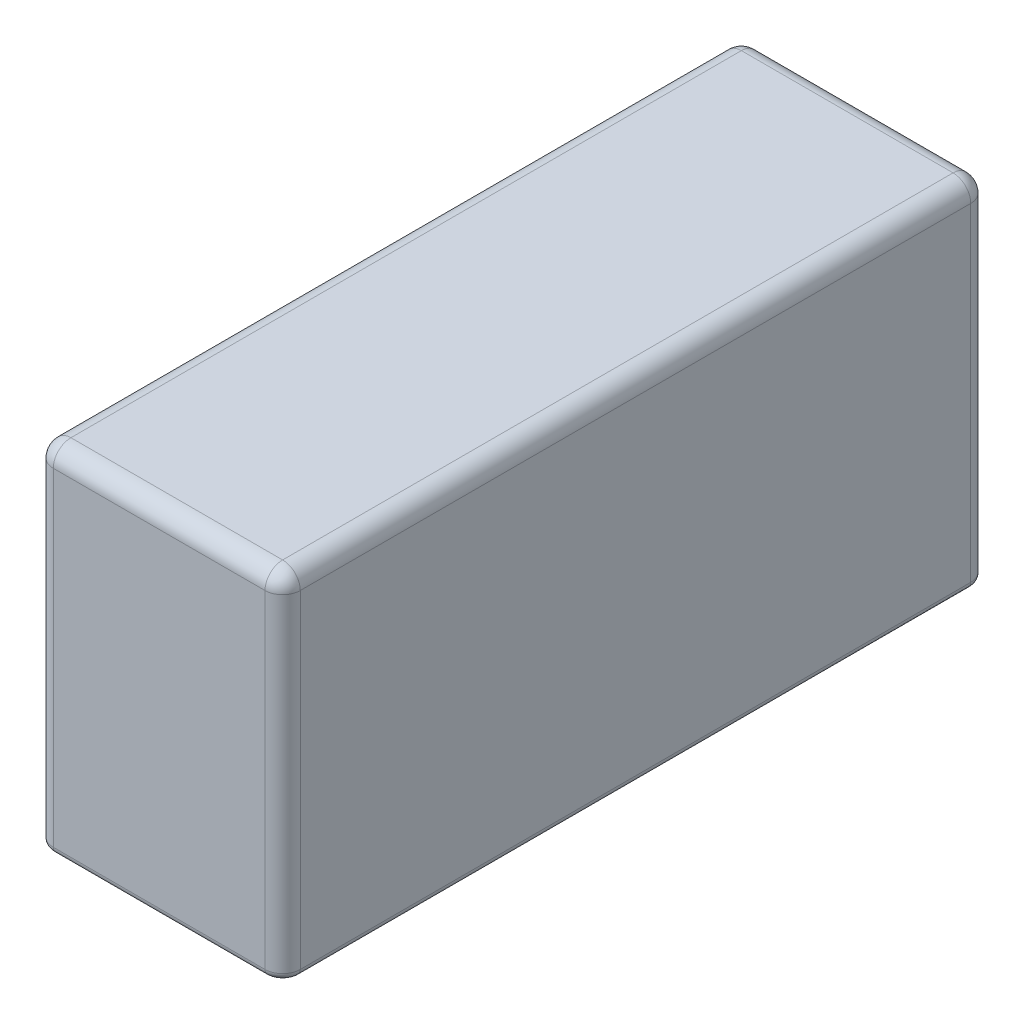
ISO-10303-21;
HEADER;
FILE_DESCRIPTION(('STEP AP214'),'2;1');
FILE_NAME('part.step','',(''),(''),'','','');
FILE_SCHEMA(('AUTOMOTIVE_DESIGN { 1 0 10303 214 1 1 1 1 }'));
ENDSEC;
DATA;
#1=APPLICATION_CONTEXT('core data for automotive mechanical design processes');
#2=APPLICATION_PROTOCOL_DEFINITION('international standard','automotive_design',2000,#1);
#3=PRODUCT_CONTEXT('',#1,'mechanical');
#4=PRODUCT('Part','Part','',(#3));
#5=PRODUCT_RELATED_PRODUCT_CATEGORY('part','',(#4));
#6=PRODUCT_DEFINITION_FORMATION('','',#4);
#7=PRODUCT_DEFINITION_CONTEXT('part definition',#1,'design');
#8=PRODUCT_DEFINITION('design','',#6,#7);
#9=PRODUCT_DEFINITION_SHAPE('','',#8);
#10=(LENGTH_UNIT() NAMED_UNIT(*) SI_UNIT(.MILLI.,.METRE.));
#11=(NAMED_UNIT(*) PLANE_ANGLE_UNIT() SI_UNIT($,.RADIAN.));
#12=(NAMED_UNIT(*) SI_UNIT($,.STERADIAN.) SOLID_ANGLE_UNIT());
#13=UNCERTAINTY_MEASURE_WITH_UNIT(LENGTH_MEASURE(1.E-05),#10,'distance_accuracy_value','');
#14=(GEOMETRIC_REPRESENTATION_CONTEXT(3) GLOBAL_UNCERTAINTY_ASSIGNED_CONTEXT((#13)) GLOBAL_UNIT_ASSIGNED_CONTEXT((#10,
#11,#12)) REPRESENTATION_CONTEXT('',''));
#15=CARTESIAN_POINT('',(0.,0.,0.));
#16=DIRECTION('',(0.,0.,1.));
#17=DIRECTION('',(1.,0.,0.));
#18=AXIS2_PLACEMENT_3D('',#15,#16,#17);
#19=CARTESIAN_POINT('',(-3.5,5.,9.99999999999999));
#20=DIRECTION('',(1.,0.,0.));
#21=DIRECTION('',(0.,0.,-1.));
#22=AXIS2_PLACEMENT_3D('',#19,#20,#21);
#23=PLANE('',#22);
#24=DIRECTION('',(0.,-1.,0.));
#25=VECTOR('',#24,1.);
#26=CARTESIAN_POINT('',(-3.5,5.,-9.50000000000001));
#27=LINE('',#26,#25);
#28=CARTESIAN_POINT('',(-3.5,4.5,-9.50000000000001));
#29=VERTEX_POINT('',#28);
#30=CARTESIAN_POINT('',(-3.5,-4.8,-9.50000000000001));
#31=VERTEX_POINT('',#30);
#32=EDGE_CURVE('E209',#29,#31,#27,.T.);
#33=ORIENTED_EDGE('',*,*,#32,.T.);
#34=DIRECTION('',(0.,0.,1.));
#35=VECTOR('',#34,1.);
#36=CARTESIAN_POINT('',(-3.5,-4.8,9.99999999999999));
#37=LINE('',#36,#35);
#38=CARTESIAN_POINT('',(-3.5,-4.8,9.49999999999999));
#39=VERTEX_POINT('',#38);
#40=EDGE_CURVE('E11',#31,#39,#37,.T.);
#41=ORIENTED_EDGE('',*,*,#40,.T.);
#42=DIRECTION('',(0.,-1.,0.));
#43=VECTOR('',#42,1.);
#44=CARTESIAN_POINT('',(-3.5,5.,9.49999999999999));
#45=LINE('',#44,#43);
#46=CARTESIAN_POINT('',(-3.5,4.5,9.49999999999999));
#47=VERTEX_POINT('',#46);
#48=EDGE_CURVE('E205',#39,#47,#45,.F.);
#49=ORIENTED_EDGE('',*,*,#48,.T.);
#50=DIRECTION('',(0.,0.,1.));
#51=VECTOR('',#50,1.);
#52=CARTESIAN_POINT('',(-3.5,4.5,-10.));
#53=LINE('',#52,#51);
#54=EDGE_CURVE('E207',#47,#29,#53,.F.);
#55=ORIENTED_EDGE('',*,*,#54,.T.);
#56=EDGE_LOOP('',(#33,#41,#49,#55));
#57=FACE_BOUND('',#56,.T.);
#58=ADVANCED_FACE('F43',(#57),#23,.F.);
#59=CARTESIAN_POINT('',(3.5,5.,9.99999999999999));
#60=DIRECTION('',(0.,0.,-1.));
#61=DIRECTION('',(-1.,0.,0.));
#62=AXIS2_PLACEMENT_3D('',#59,#60,#61);
#63=PLANE('',#62);
#64=DIRECTION('',(0.,-1.,0.));
#65=VECTOR('',#64,1.);
#66=CARTESIAN_POINT('',(-3.,5.,9.99999999999999));
#67=LINE('',#66,#65);
#68=CARTESIAN_POINT('',(-3.,4.5,9.99999999999999));
#69=VERTEX_POINT('',#68);
#70=CARTESIAN_POINT('',(-3.,-4.8,9.99999999999999));
#71=VERTEX_POINT('',#70);
#72=EDGE_CURVE('E202',#69,#71,#67,.T.);
#73=ORIENTED_EDGE('',*,*,#72,.T.);
#74=DIRECTION('',(1.,0.,0.));
#75=VECTOR('',#74,1.);
#76=CARTESIAN_POINT('',(3.5,-4.8,9.99999999999999));
#77=LINE('',#76,#75);
#78=CARTESIAN_POINT('',(3.,-4.8,9.99999999999999));
#79=VERTEX_POINT('',#78);
#80=EDGE_CURVE('E253',#71,#79,#77,.T.);
#81=ORIENTED_EDGE('',*,*,#80,.T.);
#82=DIRECTION('',(0.,-1.,0.));
#83=VECTOR('',#82,1.);
#84=CARTESIAN_POINT('',(3.,5.,9.99999999999999));
#85=LINE('',#84,#83);
#86=CARTESIAN_POINT('',(3.,4.5,9.99999999999999));
#87=VERTEX_POINT('',#86);
#88=EDGE_CURVE('E198',#79,#87,#85,.F.);
#89=ORIENTED_EDGE('',*,*,#88,.T.);
#90=DIRECTION('',(1.,0.,0.));
#91=VECTOR('',#90,1.);
#92=CARTESIAN_POINT('',(-3.5,4.5,9.99999999999999));
#93=LINE('',#92,#91);
#94=EDGE_CURVE('E200',#87,#69,#93,.F.);
#95=ORIENTED_EDGE('',*,*,#94,.T.);
#96=EDGE_LOOP('',(#73,#81,#89,#95));
#97=FACE_BOUND('',#96,.T.);
#98=ADVANCED_FACE('F324',(#97),#63,.F.);
#99=CARTESIAN_POINT('',(3.5,5.,9.99999999999999));
#100=DIRECTION('',(-1.,0.,0.));
#101=DIRECTION('',(0.,0.,1.));
#102=AXIS2_PLACEMENT_3D('',#99,#100,#101);
#103=PLANE('',#102);
#104=DIRECTION('',(0.,-1.,0.));
#105=VECTOR('',#104,1.);
#106=CARTESIAN_POINT('',(3.5,5.,9.49999999999999));
#107=LINE('',#106,#105);
#108=CARTESIAN_POINT('',(3.5,4.5,9.49999999999999));
#109=VERTEX_POINT('',#108);
#110=CARTESIAN_POINT('',(3.5,-4.8,9.49999999999999));
#111=VERTEX_POINT('',#110);
#112=EDGE_CURVE('E191',#109,#111,#107,.T.);
#113=ORIENTED_EDGE('',*,*,#112,.T.);
#114=DIRECTION('',(0.,0.,-1.));
#115=VECTOR('',#114,1.);
#116=CARTESIAN_POINT('',(3.5,-4.8,9.99999999999999));
#117=LINE('',#116,#115);
#118=CARTESIAN_POINT('',(3.5,-4.8,-9.50000000000001));
#119=VERTEX_POINT('',#118);
#120=EDGE_CURVE('E257',#111,#119,#117,.T.);
#121=ORIENTED_EDGE('',*,*,#120,.T.);
#122=DIRECTION('',(0.,-1.,0.));
#123=VECTOR('',#122,1.);
#124=CARTESIAN_POINT('',(3.5,5.,-9.50000000000001));
#125=LINE('',#124,#123);
#126=CARTESIAN_POINT('',(3.5,4.5,-9.50000000000001));
#127=VERTEX_POINT('',#126);
#128=EDGE_CURVE('E196',#119,#127,#125,.F.);
#129=ORIENTED_EDGE('',*,*,#128,.T.);
#130=DIRECTION('',(0.,0.,-1.));
#131=VECTOR('',#130,1.);
#132=CARTESIAN_POINT('',(3.5,4.5,9.99999999999999));
#133=LINE('',#132,#131);
#134=EDGE_CURVE('E194',#127,#109,#133,.F.);
#135=ORIENTED_EDGE('',*,*,#134,.T.);
#136=EDGE_LOOP('',(#113,#121,#129,#135));
#137=FACE_BOUND('',#136,.T.);
#138=ADVANCED_FACE('F359',(#137),#103,.F.);
#139=CARTESIAN_POINT('',(3.5,5.,-10.));
#140=DIRECTION('',(0.,0.,1.));
#141=DIRECTION('',(1.,0.,0.));
#142=AXIS2_PLACEMENT_3D('',#139,#140,#141);
#143=PLANE('',#142);
#144=DIRECTION('',(0.,-1.,0.));
#145=VECTOR('',#144,1.);
#146=CARTESIAN_POINT('',(3.,5.,-10.));
#147=LINE('',#146,#145);
#148=CARTESIAN_POINT('',(3.,4.5,-10.));
#149=VERTEX_POINT('',#148);
#150=CARTESIAN_POINT('',(3.,-4.8,-10.));
#151=VERTEX_POINT('',#150);
#152=EDGE_CURVE('E182',#149,#151,#147,.T.);
#153=ORIENTED_EDGE('',*,*,#152,.T.);
#154=DIRECTION('',(-1.,0.,0.));
#155=VECTOR('',#154,1.);
#156=CARTESIAN_POINT('',(3.5,-4.8,-10.));
#157=LINE('',#156,#155);
#158=CARTESIAN_POINT('',(-3.,-4.8,-10.));
#159=VERTEX_POINT('',#158);
#160=EDGE_CURVE('E67',#151,#159,#157,.T.);
#161=ORIENTED_EDGE('',*,*,#160,.T.);
#162=DIRECTION('',(0.,-1.,0.));
#163=VECTOR('',#162,1.);
#164=CARTESIAN_POINT('',(-3.,5.,-10.));
#165=LINE('',#164,#163);
#166=CARTESIAN_POINT('',(-3.,4.5,-10.));
#167=VERTEX_POINT('',#166);
#168=EDGE_CURVE('E189',#159,#167,#165,.F.);
#169=ORIENTED_EDGE('',*,*,#168,.T.);
#170=DIRECTION('',(-1.,0.,0.));
#171=VECTOR('',#170,1.);
#172=CARTESIAN_POINT('',(3.5,4.5,-10.));
#173=LINE('',#172,#171);
#174=EDGE_CURVE('E153',#167,#149,#173,.F.);
#175=ORIENTED_EDGE('',*,*,#174,.T.);
#176=EDGE_LOOP('',(#153,#161,#169,#175));
#177=FACE_BOUND('',#176,.T.);
#178=ADVANCED_FACE('F298',(#177),#143,.F.);
#179=CARTESIAN_POINT('',(0.,5.,0.));
#180=DIRECTION('',(0.,1.,0.));
#181=DIRECTION('',(0.,0.,1.));
#182=AXIS2_PLACEMENT_3D('',#179,#180,#181);
#183=PLANE('',#182);
#184=DIRECTION('',(0.,0.,-1.));
#185=VECTOR('',#184,1.);
#186=CARTESIAN_POINT('',(3.,5.,-10.));
#187=LINE('',#186,#185);
#188=CARTESIAN_POINT('',(3.,5.,9.49999999999999));
#189=VERTEX_POINT('',#188);
#190=CARTESIAN_POINT('',(3.,5.,-9.50000000000001));
#191=VERTEX_POINT('',#190);
#192=EDGE_CURVE('E180',#189,#191,#187,.T.);
#193=ORIENTED_EDGE('',*,*,#192,.T.);
#194=DIRECTION('',(-1.,0.,0.));
#195=VECTOR('',#194,1.);
#196=CARTESIAN_POINT('',(-3.5,5.,-9.50000000000001));
#197=LINE('',#196,#195);
#198=CARTESIAN_POINT('',(-3.,5.,-9.50000000000001));
#199=VERTEX_POINT('',#198);
#200=EDGE_CURVE('E151',#191,#199,#197,.T.);
#201=ORIENTED_EDGE('',*,*,#200,.T.);
#202=DIRECTION('',(0.,0.,1.));
#203=VECTOR('',#202,1.);
#204=CARTESIAN_POINT('',(-3.,5.,9.99999999999999));
#205=LINE('',#204,#203);
#206=CARTESIAN_POINT('',(-3.,5.,9.49999999999999));
#207=VERTEX_POINT('',#206);
#208=EDGE_CURVE('E169',#199,#207,#205,.T.);
#209=ORIENTED_EDGE('',*,*,#208,.T.);
#210=DIRECTION('',(1.,0.,0.));
#211=VECTOR('',#210,1.);
#212=CARTESIAN_POINT('',(3.5,5.,9.49999999999999));
#213=LINE('',#212,#211);
#214=EDGE_CURVE('E175',#207,#189,#213,.T.);
#215=ORIENTED_EDGE('',*,*,#214,.T.);
#216=EDGE_LOOP('',(#193,#201,#209,#215));
#217=FACE_BOUND('',#216,.T.);
#218=ADVANCED_FACE('F178',(#217),#183,.T.);
#219=CARTESIAN_POINT('',(0.,-5.,0.));
#220=DIRECTION('',(0.,1.,0.));
#221=DIRECTION('',(0.,0.,1.));
#222=AXIS2_PLACEMENT_3D('',#219,#220,#221);
#223=PLANE('',#222);
#224=DIRECTION('',(1.,0.,0.));
#225=VECTOR('',#224,1.);
#226=CARTESIAN_POINT('',(0.,-5.,9.79999999999999));
#227=LINE('',#226,#225);
#228=CARTESIAN_POINT('',(3.,-5.,9.79999999999999));
#229=VERTEX_POINT('',#228);
#230=CARTESIAN_POINT('',(-3.,-5.,9.79999999999999));
#231=VERTEX_POINT('',#230);
#232=EDGE_CURVE('E245',#229,#231,#227,.F.);
#233=ORIENTED_EDGE('',*,*,#232,.T.);
#234=CARTESIAN_POINT('',(-3.,-5.,9.49999999999999));
#235=DIRECTION('',(0.,1.,0.));
#236=DIRECTION('',(0.,0.,1.));
#237=AXIS2_PLACEMENT_3D('',#234,#235,#236);
#238=CIRCLE('',#237,0.3);
#239=CARTESIAN_POINT('',(-3.3,-5.,9.49999999999999));
#240=VERTEX_POINT('',#239);
#241=EDGE_CURVE('E247',#231,#240,#238,.F.);
#242=ORIENTED_EDGE('',*,*,#241,.T.);
#243=DIRECTION('',(0.,0.,1.));
#244=VECTOR('',#243,1.);
#245=CARTESIAN_POINT('',(-3.3,-5.,0.));
#246=LINE('',#245,#244);
#247=CARTESIAN_POINT('',(-3.3,-5.,-9.50000000000001));
#248=VERTEX_POINT('',#247);
#249=EDGE_CURVE('E210',#240,#248,#246,.F.);
#250=ORIENTED_EDGE('',*,*,#249,.T.);
#251=CARTESIAN_POINT('',(-3.,-5.,-9.50000000000001));
#252=DIRECTION('',(0.,1.,0.));
#253=DIRECTION('',(0.,0.,1.));
#254=AXIS2_PLACEMENT_3D('',#251,#252,#253);
#255=CIRCLE('',#254,0.3);
#256=CARTESIAN_POINT('',(-3.,-5.,-9.80000000000001));
#257=VERTEX_POINT('',#256);
#258=EDGE_CURVE('E235',#248,#257,#255,.F.);
#259=ORIENTED_EDGE('',*,*,#258,.T.);
#260=DIRECTION('',(-1.,0.,0.));
#261=VECTOR('',#260,1.);
#262=CARTESIAN_POINT('',(0.,-5.,-9.80000000000001));
#263=LINE('',#262,#261);
#264=CARTESIAN_POINT('',(3.,-5.,-9.80000000000001));
#265=VERTEX_POINT('',#264);
#266=EDGE_CURVE('E237',#257,#265,#263,.F.);
#267=ORIENTED_EDGE('',*,*,#266,.T.);
#268=CARTESIAN_POINT('',(3.,-5.,-9.50000000000001));
#269=DIRECTION('',(0.,1.,0.));
#270=DIRECTION('',(0.,0.,1.));
#271=AXIS2_PLACEMENT_3D('',#268,#269,#270);
#272=CIRCLE('',#271,0.3);
#273=CARTESIAN_POINT('',(3.3,-5.,-9.50000000000001));
#274=VERTEX_POINT('',#273);
#275=EDGE_CURVE('E239',#265,#274,#272,.F.);
#276=ORIENTED_EDGE('',*,*,#275,.T.);
#277=DIRECTION('',(0.,0.,-1.));
#278=VECTOR('',#277,1.);
#279=CARTESIAN_POINT('',(3.3,-5.,0.));
#280=LINE('',#279,#278);
#281=CARTESIAN_POINT('',(3.3,-5.,9.49999999999999));
#282=VERTEX_POINT('',#281);
#283=EDGE_CURVE('E241',#274,#282,#280,.F.);
#284=ORIENTED_EDGE('',*,*,#283,.T.);
#285=CARTESIAN_POINT('',(3.,-5.,9.49999999999999));
#286=DIRECTION('',(0.,1.,0.));
#287=DIRECTION('',(0.,0.,1.));
#288=AXIS2_PLACEMENT_3D('',#285,#286,#287);
#289=CIRCLE('',#288,0.3);
#290=EDGE_CURVE('E243',#282,#229,#289,.F.);
#291=ORIENTED_EDGE('',*,*,#290,.T.);
#292=EDGE_LOOP('',(#233,#242,#250,#259,#267,#276,#284,#291));
#293=FACE_BOUND('',#292,.T.);
#294=ADVANCED_FACE('F391',(#293),#223,.F.);
#295=CARTESIAN_POINT('',(3.,5.,9.49999999999999));
#296=DIRECTION('',(0.,-1.,0.));
#297=DIRECTION('',(0.,0.,-1.));
#298=AXIS2_PLACEMENT_3D('',#295,#296,#297);
#299=CYLINDRICAL_SURFACE('',#298,0.5);
#300=ORIENTED_EDGE('',*,*,#88,.F.);
#301=CARTESIAN_POINT('',(3.,-4.8,9.49999999999999));
#302=DIRECTION('',(0.,1.,0.));
#303=DIRECTION('',(0.,0.,1.));
#304=AXIS2_PLACEMENT_3D('',#301,#302,#303);
#305=CIRCLE('',#304,0.5);
#306=EDGE_CURVE('E255',#79,#111,#305,.T.);
#307=ORIENTED_EDGE('',*,*,#306,.T.);
#308=ORIENTED_EDGE('',*,*,#112,.F.);
#309=CARTESIAN_POINT('',(3.,4.5,9.49999999999999));
#310=DIRECTION('',(0.,1.,0.));
#311=DIRECTION('',(0.,0.,1.));
#312=AXIS2_PLACEMENT_3D('',#309,#310,#311);
#313=CIRCLE('',#312,0.5);
#314=EDGE_CURVE('E176',#87,#109,#313,.T.);
#315=ORIENTED_EDGE('',*,*,#314,.F.);
#316=EDGE_LOOP('',(#300,#307,#308,#315));
#317=FACE_BOUND('',#316,.T.);
#318=ADVANCED_FACE('F334',(#317),#299,.T.);
#319=CARTESIAN_POINT('',(0.,4.5,9.49999999999999));
#320=DIRECTION('',(-1.,0.,0.));
#321=DIRECTION('',(0.,0.,1.));
#322=AXIS2_PLACEMENT_3D('',#319,#320,#321);
#323=CYLINDRICAL_SURFACE('',#322,0.5);
#324=CARTESIAN_POINT('',(-3.,4.5,9.49999999999999));
#325=DIRECTION('',(-1.,0.,0.));
#326=DIRECTION('',(0.,-1.,0.));
#327=AXIS2_PLACEMENT_3D('',#324,#325,#326);
#328=CIRCLE('',#327,0.5);
#329=EDGE_CURVE('E226',#69,#207,#328,.T.);
#330=ORIENTED_EDGE('',*,*,#329,.F.);
#331=ORIENTED_EDGE('',*,*,#94,.F.);
#332=CARTESIAN_POINT('',(3.,4.5,9.49999999999999));
#333=DIRECTION('',(1.,0.,0.));
#334=DIRECTION('',(0.,0.,-1.));
#335=AXIS2_PLACEMENT_3D('',#332,#333,#334);
#336=CIRCLE('',#335,0.5);
#337=EDGE_CURVE('E229',#189,#87,#336,.T.);
#338=ORIENTED_EDGE('',*,*,#337,.F.);
#339=ORIENTED_EDGE('',*,*,#214,.F.);
#340=EDGE_LOOP('',(#330,#331,#338,#339));
#341=FACE_BOUND('',#340,.T.);
#342=ADVANCED_FACE('F330',(#341),#323,.T.);
#343=CARTESIAN_POINT('',(-3.,5.,9.49999999999999));
#344=DIRECTION('',(0.,-1.,0.));
#345=DIRECTION('',(0.,0.,-1.));
#346=AXIS2_PLACEMENT_3D('',#343,#344,#345);
#347=CYLINDRICAL_SURFACE('',#346,0.5);
#348=ORIENTED_EDGE('',*,*,#48,.F.);
#349=CARTESIAN_POINT('',(-3.,-4.8,9.49999999999999));
#350=DIRECTION('',(0.,1.,0.));
#351=DIRECTION('',(0.,0.,1.));
#352=AXIS2_PLACEMENT_3D('',#349,#350,#351);
#353=CIRCLE('',#352,0.5);
#354=EDGE_CURVE('E250',#39,#71,#353,.T.);
#355=ORIENTED_EDGE('',*,*,#354,.T.);
#356=ORIENTED_EDGE('',*,*,#72,.F.);
#357=CARTESIAN_POINT('',(-3.,4.5,9.49999999999999));
#358=DIRECTION('',(0.,1.,0.));
#359=DIRECTION('',(0.,0.,1.));
#360=AXIS2_PLACEMENT_3D('',#357,#358,#359);
#361=CIRCLE('',#360,0.5);
#362=EDGE_CURVE('E223',#47,#69,#361,.T.);
#363=ORIENTED_EDGE('',*,*,#362,.F.);
#364=EDGE_LOOP('',(#348,#355,#356,#363));
#365=FACE_BOUND('',#364,.T.);
#366=ADVANCED_FACE('F320',(#365),#347,.T.);
#367=CARTESIAN_POINT('',(3.,4.5,9.49999999999999));
#368=DIRECTION('',(0.,0.,1.));
#369=DIRECTION('',(1.,0.,0.));
#370=AXIS2_PLACEMENT_3D('',#367,#368,#369);
#371=SPHERICAL_SURFACE('',#370,0.5);
#372=ORIENTED_EDGE('',*,*,#337,.T.);
#373=ORIENTED_EDGE('',*,*,#314,.T.);
#374=CARTESIAN_POINT('',(3.,4.5,9.49999999999999));
#375=DIRECTION('',(0.,0.,1.));
#376=DIRECTION('',(1.,0.,0.));
#377=AXIS2_PLACEMENT_3D('',#374,#375,#376);
#378=CIRCLE('',#377,0.5);
#379=EDGE_CURVE('E220',#189,#109,#378,.F.);
#380=ORIENTED_EDGE('',*,*,#379,.F.);
#381=EDGE_LOOP('',(#372,#373,#380));
#382=FACE_BOUND('',#381,.T.);
#383=ADVANCED_FACE('F337',(#382),#371,.T.);
#384=CARTESIAN_POINT('',(-3.,4.5,9.49999999999999));
#385=DIRECTION('',(0.,0.,1.));
#386=DIRECTION('',(1.,0.,0.));
#387=AXIS2_PLACEMENT_3D('',#384,#385,#386);
#388=SPHERICAL_SURFACE('',#387,0.5);
#389=ORIENTED_EDGE('',*,*,#362,.T.);
#390=ORIENTED_EDGE('',*,*,#329,.T.);
#391=CARTESIAN_POINT('',(-3.,4.5,9.49999999999999));
#392=DIRECTION('',(0.,0.,1.));
#393=DIRECTION('',(1.,0.,0.));
#394=AXIS2_PLACEMENT_3D('',#391,#392,#393);
#395=CIRCLE('',#394,0.5);
#396=EDGE_CURVE('E172',#47,#207,#395,.F.);
#397=ORIENTED_EDGE('',*,*,#396,.F.);
#398=EDGE_LOOP('',(#389,#390,#397));
#399=FACE_BOUND('',#398,.T.);
#400=ADVANCED_FACE('F398',(#399),#388,.T.);
#401=CARTESIAN_POINT('',(3.,5.,-9.50000000000001));
#402=DIRECTION('',(0.,-1.,0.));
#403=DIRECTION('',(0.,0.,-1.));
#404=AXIS2_PLACEMENT_3D('',#401,#402,#403);
#405=CYLINDRICAL_SURFACE('',#404,0.5);
#406=ORIENTED_EDGE('',*,*,#128,.F.);
#407=CARTESIAN_POINT('',(3.,-4.8,-9.50000000000001));
#408=DIRECTION('',(0.,1.,0.));
#409=DIRECTION('',(0.,0.,1.));
#410=AXIS2_PLACEMENT_3D('',#407,#408,#409);
#411=CIRCLE('',#410,0.5);
#412=EDGE_CURVE('E259',#119,#151,#411,.T.);
#413=ORIENTED_EDGE('',*,*,#412,.T.);
#414=ORIENTED_EDGE('',*,*,#152,.F.);
#415=CARTESIAN_POINT('',(3.,4.5,-9.50000000000001));
#416=DIRECTION('',(0.,1.,0.));
#417=DIRECTION('',(0.,0.,1.));
#418=AXIS2_PLACEMENT_3D('',#415,#416,#417);
#419=CIRCLE('',#418,0.5);
#420=EDGE_CURVE('E216',#127,#149,#419,.T.);
#421=ORIENTED_EDGE('',*,*,#420,.F.);
#422=EDGE_LOOP('',(#406,#413,#414,#421));
#423=FACE_BOUND('',#422,.T.);
#424=ADVANCED_FACE('F296',(#423),#405,.T.);
#425=CARTESIAN_POINT('',(3.,4.5,0.));
#426=DIRECTION('',(0.,0.,1.));
#427=DIRECTION('',(1.,0.,0.));
#428=AXIS2_PLACEMENT_3D('',#425,#426,#427);
#429=CYLINDRICAL_SURFACE('',#428,0.5);
#430=ORIENTED_EDGE('',*,*,#379,.T.);
#431=ORIENTED_EDGE('',*,*,#134,.F.);
#432=CARTESIAN_POINT('',(3.,4.5,-9.50000000000001));
#433=DIRECTION('',(0.,0.,-1.));
#434=DIRECTION('',(-1.,0.,0.));
#435=AXIS2_PLACEMENT_3D('',#432,#433,#434);
#436=CIRCLE('',#435,0.5);
#437=EDGE_CURVE('E166',#191,#127,#436,.T.);
#438=ORIENTED_EDGE('',*,*,#437,.F.);
#439=ORIENTED_EDGE('',*,*,#192,.F.);
#440=EDGE_LOOP('',(#430,#431,#438,#439));
#441=FACE_BOUND('',#440,.T.);
#442=ADVANCED_FACE('F340',(#441),#429,.T.);
#443=CARTESIAN_POINT('',(-3.,4.5,0.));
#444=DIRECTION('',(0.,0.,-1.));
#445=DIRECTION('',(-1.,0.,0.));
#446=AXIS2_PLACEMENT_3D('',#443,#444,#445);
#447=CYLINDRICAL_SURFACE('',#446,0.5);
#448=ORIENTED_EDGE('',*,*,#396,.T.);
#449=ORIENTED_EDGE('',*,*,#208,.F.);
#450=CARTESIAN_POINT('',(-3.,4.5,-9.50000000000001));
#451=DIRECTION('',(0.,0.,-1.));
#452=DIRECTION('',(-1.,0.,0.));
#453=AXIS2_PLACEMENT_3D('',#450,#451,#452);
#454=CIRCLE('',#453,0.5);
#455=EDGE_CURVE('E159',#29,#199,#454,.T.);
#456=ORIENTED_EDGE('',*,*,#455,.F.);
#457=ORIENTED_EDGE('',*,*,#54,.F.);
#458=EDGE_LOOP('',(#448,#449,#456,#457));
#459=FACE_BOUND('',#458,.T.);
#460=ADVANCED_FACE('F170',(#459),#447,.T.);
#461=CARTESIAN_POINT('',(-3.,5.,-9.50000000000001));
#462=DIRECTION('',(0.,-1.,0.));
#463=DIRECTION('',(0.,0.,-1.));
#464=AXIS2_PLACEMENT_3D('',#461,#462,#463);
#465=CYLINDRICAL_SURFACE('',#464,0.5);
#466=ORIENTED_EDGE('',*,*,#168,.F.);
#467=CARTESIAN_POINT('',(-3.,-4.8,-9.50000000000001));
#468=DIRECTION('',(0.,1.,0.));
#469=DIRECTION('',(0.,0.,1.));
#470=AXIS2_PLACEMENT_3D('',#467,#468,#469);
#471=CIRCLE('',#470,0.5);
#472=EDGE_CURVE('E52',#159,#31,#471,.T.);
#473=ORIENTED_EDGE('',*,*,#472,.T.);
#474=ORIENTED_EDGE('',*,*,#32,.F.);
#475=CARTESIAN_POINT('',(-3.,4.5,-9.50000000000001));
#476=DIRECTION('',(0.,1.,0.));
#477=DIRECTION('',(0.,0.,1.));
#478=AXIS2_PLACEMENT_3D('',#475,#476,#477);
#479=CIRCLE('',#478,0.5);
#480=EDGE_CURVE('E163',#167,#29,#479,.T.);
#481=ORIENTED_EDGE('',*,*,#480,.F.);
#482=EDGE_LOOP('',(#466,#473,#474,#481));
#483=FACE_BOUND('',#482,.T.);
#484=ADVANCED_FACE('F300',(#483),#465,.T.);
#485=CARTESIAN_POINT('',(3.,4.5,-9.50000000000001));
#486=DIRECTION('',(1.,0.,0.));
#487=DIRECTION('',(0.,0.,-1.));
#488=AXIS2_PLACEMENT_3D('',#485,#486,#487);
#489=SPHERICAL_SURFACE('',#488,0.5);
#490=ORIENTED_EDGE('',*,*,#437,.T.);
#491=ORIENTED_EDGE('',*,*,#420,.T.);
#492=CARTESIAN_POINT('',(3.,4.5,-9.50000000000001));
#493=DIRECTION('',(1.,0.,0.));
#494=DIRECTION('',(0.,0.,-1.));
#495=AXIS2_PLACEMENT_3D('',#492,#493,#494);
#496=CIRCLE('',#495,0.5);
#497=EDGE_CURVE('E156',#191,#149,#496,.F.);
#498=ORIENTED_EDGE('',*,*,#497,.F.);
#499=EDGE_LOOP('',(#490,#491,#498));
#500=FACE_BOUND('',#499,.T.);
#501=ADVANCED_FACE('F343',(#500),#489,.T.);
#502=CARTESIAN_POINT('',(-3.,4.5,-9.50000000000001));
#503=DIRECTION('',(-1.,0.,0.));
#504=DIRECTION('',(0.,0.,1.));
#505=AXIS2_PLACEMENT_3D('',#502,#503,#504);
#506=SPHERICAL_SURFACE('',#505,0.5);
#507=ORIENTED_EDGE('',*,*,#480,.T.);
#508=ORIENTED_EDGE('',*,*,#455,.T.);
#509=CARTESIAN_POINT('',(-3.,4.5,-9.50000000000001));
#510=DIRECTION('',(-1.,0.,0.));
#511=DIRECTION('',(0.,0.,1.));
#512=AXIS2_PLACEMENT_3D('',#509,#510,#511);
#513=CIRCLE('',#512,0.5);
#514=EDGE_CURVE('E147',#167,#199,#513,.F.);
#515=ORIENTED_EDGE('',*,*,#514,.F.);
#516=EDGE_LOOP('',(#507,#508,#515));
#517=FACE_BOUND('',#516,.T.);
#518=ADVANCED_FACE('F161',(#517),#506,.T.);
#519=CARTESIAN_POINT('',(0.,4.5,-9.50000000000001));
#520=DIRECTION('',(1.,0.,0.));
#521=DIRECTION('',(0.,0.,-1.));
#522=AXIS2_PLACEMENT_3D('',#519,#520,#521);
#523=CYLINDRICAL_SURFACE('',#522,0.5);
#524=ORIENTED_EDGE('',*,*,#497,.T.);
#525=ORIENTED_EDGE('',*,*,#174,.F.);
#526=ORIENTED_EDGE('',*,*,#514,.T.);
#527=ORIENTED_EDGE('',*,*,#200,.F.);
#528=EDGE_LOOP('',(#524,#525,#526,#527));
#529=FACE_BOUND('',#528,.T.);
#530=ADVANCED_FACE('F149',(#529),#523,.T.);
#531=CARTESIAN_POINT('',(3.,-4.8,-9.50000000000001));
#532=DIRECTION('',(0.,1.,0.));
#533=DIRECTION('',(0.,0.,1.));
#534=AXIS2_PLACEMENT_3D('',#531,#532,#533);
#535=TOROIDAL_SURFACE('',#534,0.3,0.2);
#536=CARTESIAN_POINT('',(3.,-4.8,-9.80000000000001));
#537=DIRECTION('',(-1.,0.,0.));
#538=DIRECTION('',(0.,0.,1.));
#539=AXIS2_PLACEMENT_3D('',#536,#537,#538);
#540=CIRCLE('',#539,0.2);
#541=EDGE_CURVE('E278',#151,#265,#540,.T.);
#542=ORIENTED_EDGE('',*,*,#541,.F.);
#543=ORIENTED_EDGE('',*,*,#412,.F.);
#544=CARTESIAN_POINT('',(3.3,-4.8,-9.50000000000001));
#545=DIRECTION('',(0.,0.,1.));
#546=DIRECTION('',(1.,0.,0.));
#547=AXIS2_PLACEMENT_3D('',#544,#545,#546);
#548=CIRCLE('',#547,0.2);
#549=EDGE_CURVE('E47',#274,#119,#548,.T.);
#550=ORIENTED_EDGE('',*,*,#549,.F.);
#551=ORIENTED_EDGE('',*,*,#275,.F.);
#552=EDGE_LOOP('',(#542,#543,#550,#551));
#553=FACE_BOUND('',#552,.T.);
#554=ADVANCED_FACE('F45',(#553),#535,.T.);
#555=CARTESIAN_POINT('',(3.3,-4.8,9.99999999999999));
#556=DIRECTION('',(0.,0.,-1.));
#557=DIRECTION('',(-1.,0.,0.));
#558=AXIS2_PLACEMENT_3D('',#555,#556,#557);
#559=CYLINDRICAL_SURFACE('',#558,0.2);
#560=ORIENTED_EDGE('',*,*,#549,.T.);
#561=ORIENTED_EDGE('',*,*,#120,.F.);
#562=CARTESIAN_POINT('',(3.3,-4.8,9.49999999999999));
#563=DIRECTION('',(0.,0.,1.));
#564=DIRECTION('',(1.,0.,0.));
#565=AXIS2_PLACEMENT_3D('',#562,#563,#564);
#566=CIRCLE('',#565,0.2);
#567=EDGE_CURVE('E276',#282,#111,#566,.T.);
#568=ORIENTED_EDGE('',*,*,#567,.F.);
#569=ORIENTED_EDGE('',*,*,#283,.F.);
#570=EDGE_LOOP('',(#560,#561,#568,#569));
#571=FACE_BOUND('',#570,.T.);
#572=ADVANCED_FACE('F288',(#571),#559,.T.);
#573=CARTESIAN_POINT('',(3.5,-4.8,-9.80000000000001));
#574=DIRECTION('',(-1.,0.,0.));
#575=DIRECTION('',(0.,0.,1.));
#576=AXIS2_PLACEMENT_3D('',#573,#574,#575);
#577=CYLINDRICAL_SURFACE('',#576,0.2);
#578=ORIENTED_EDGE('',*,*,#541,.T.);
#579=ORIENTED_EDGE('',*,*,#266,.F.);
#580=CARTESIAN_POINT('',(-3.,-4.8,-9.80000000000001));
#581=DIRECTION('',(-1.,0.,0.));
#582=DIRECTION('',(0.,0.,1.));
#583=AXIS2_PLACEMENT_3D('',#580,#581,#582);
#584=CIRCLE('',#583,0.2);
#585=EDGE_CURVE('E273',#159,#257,#584,.T.);
#586=ORIENTED_EDGE('',*,*,#585,.F.);
#587=ORIENTED_EDGE('',*,*,#160,.F.);
#588=EDGE_LOOP('',(#578,#579,#586,#587));
#589=FACE_BOUND('',#588,.T.);
#590=ADVANCED_FACE('F369',(#589),#577,.T.);
#591=CARTESIAN_POINT('',(3.,-4.8,9.49999999999999));
#592=DIRECTION('',(0.,1.,0.));
#593=DIRECTION('',(0.,0.,1.));
#594=AXIS2_PLACEMENT_3D('',#591,#592,#593);
#595=TOROIDAL_SURFACE('',#594,0.3,0.2);
#596=ORIENTED_EDGE('',*,*,#567,.T.);
#597=ORIENTED_EDGE('',*,*,#306,.F.);
#598=CARTESIAN_POINT('',(3.,-4.8,9.79999999999999));
#599=DIRECTION('',(-1.,0.,0.));
#600=DIRECTION('',(0.,0.,1.));
#601=AXIS2_PLACEMENT_3D('',#598,#599,#600);
#602=CIRCLE('',#601,0.2);
#603=EDGE_CURVE('E270',#229,#79,#602,.T.);
#604=ORIENTED_EDGE('',*,*,#603,.F.);
#605=ORIENTED_EDGE('',*,*,#290,.F.);
#606=EDGE_LOOP('',(#596,#597,#604,#605));
#607=FACE_BOUND('',#606,.T.);
#608=ADVANCED_FACE('F373',(#607),#595,.T.);
#609=CARTESIAN_POINT('',(-3.,-4.8,-9.50000000000001));
#610=DIRECTION('',(0.,1.,0.));
#611=DIRECTION('',(0.,0.,1.));
#612=AXIS2_PLACEMENT_3D('',#609,#610,#611);
#613=TOROIDAL_SURFACE('',#612,0.3,0.2);
#614=ORIENTED_EDGE('',*,*,#585,.T.);
#615=ORIENTED_EDGE('',*,*,#258,.F.);
#616=CARTESIAN_POINT('',(-3.3,-4.8,-9.50000000000001));
#617=DIRECTION('',(0.,0.,1.));
#618=DIRECTION('',(1.,0.,0.));
#619=AXIS2_PLACEMENT_3D('',#616,#617,#618);
#620=CIRCLE('',#619,0.2);
#621=EDGE_CURVE('E267',#31,#248,#620,.T.);
#622=ORIENTED_EDGE('',*,*,#621,.F.);
#623=ORIENTED_EDGE('',*,*,#472,.F.);
#624=EDGE_LOOP('',(#614,#615,#622,#623));
#625=FACE_BOUND('',#624,.T.);
#626=ADVANCED_FACE('F307',(#625),#613,.T.);
#627=CARTESIAN_POINT('',(3.5,-4.8,9.79999999999999));
#628=DIRECTION('',(1.,0.,0.));
#629=DIRECTION('',(0.,0.,-1.));
#630=AXIS2_PLACEMENT_3D('',#627,#628,#629);
#631=CYLINDRICAL_SURFACE('',#630,0.2);
#632=ORIENTED_EDGE('',*,*,#603,.T.);
#633=ORIENTED_EDGE('',*,*,#80,.F.);
#634=CARTESIAN_POINT('',(-3.,-4.8,9.79999999999999));
#635=DIRECTION('',(-1.,0.,0.));
#636=DIRECTION('',(0.,0.,1.));
#637=AXIS2_PLACEMENT_3D('',#634,#635,#636);
#638=CIRCLE('',#637,0.2);
#639=EDGE_CURVE('E265',#231,#71,#638,.T.);
#640=ORIENTED_EDGE('',*,*,#639,.F.);
#641=ORIENTED_EDGE('',*,*,#232,.F.);
#642=EDGE_LOOP('',(#632,#633,#640,#641));
#643=FACE_BOUND('',#642,.T.);
#644=ADVANCED_FACE('F381',(#643),#631,.T.);
#645=CARTESIAN_POINT('',(-3.3,-4.8,9.99999999999999));
#646=DIRECTION('',(0.,0.,1.));
#647=DIRECTION('',(1.,0.,0.));
#648=AXIS2_PLACEMENT_3D('',#645,#646,#647);
#649=CYLINDRICAL_SURFACE('',#648,0.2);
#650=ORIENTED_EDGE('',*,*,#621,.T.);
#651=ORIENTED_EDGE('',*,*,#249,.F.);
#652=CARTESIAN_POINT('',(-3.3,-4.8,9.49999999999999));
#653=DIRECTION('',(0.,0.,1.));
#654=DIRECTION('',(1.,0.,0.));
#655=AXIS2_PLACEMENT_3D('',#652,#653,#654);
#656=CIRCLE('',#655,0.2);
#657=EDGE_CURVE('E263',#39,#240,#656,.T.);
#658=ORIENTED_EDGE('',*,*,#657,.F.);
#659=ORIENTED_EDGE('',*,*,#40,.F.);
#660=EDGE_LOOP('',(#650,#651,#658,#659));
#661=FACE_BOUND('',#660,.T.);
#662=ADVANCED_FACE('F311',(#661),#649,.T.);
#663=CARTESIAN_POINT('',(-3.,-4.8,9.49999999999999));
#664=DIRECTION('',(0.,1.,0.));
#665=DIRECTION('',(0.,0.,1.));
#666=AXIS2_PLACEMENT_3D('',#663,#664,#665);
#667=TOROIDAL_SURFACE('',#666,0.3,0.2);
#668=ORIENTED_EDGE('',*,*,#639,.T.);
#669=ORIENTED_EDGE('',*,*,#354,.F.);
#670=ORIENTED_EDGE('',*,*,#657,.T.);
#671=ORIENTED_EDGE('',*,*,#241,.F.);
#672=EDGE_LOOP('',(#668,#669,#670,#671));
#673=FACE_BOUND('',#672,.T.);
#674=ADVANCED_FACE('F315',(#673),#667,.T.);
#675=CLOSED_SHELL('',(#58,#98,#138,#178,#218,#294,#318,#342,#366,#383,#400,#424,#442,#460,#484,
#501,#518,#530,#554,#572,#590,#608,#626,#644,#662,#674));
#676=MANIFOLD_SOLID_BREP('B2',#675);
#677=ADVANCED_BREP_SHAPE_REPRESENTATION('',(#18,#676),#14);
#678=SHAPE_DEFINITION_REPRESENTATION(#9,#677);
ENDSEC;
END-ISO-10303-21;
